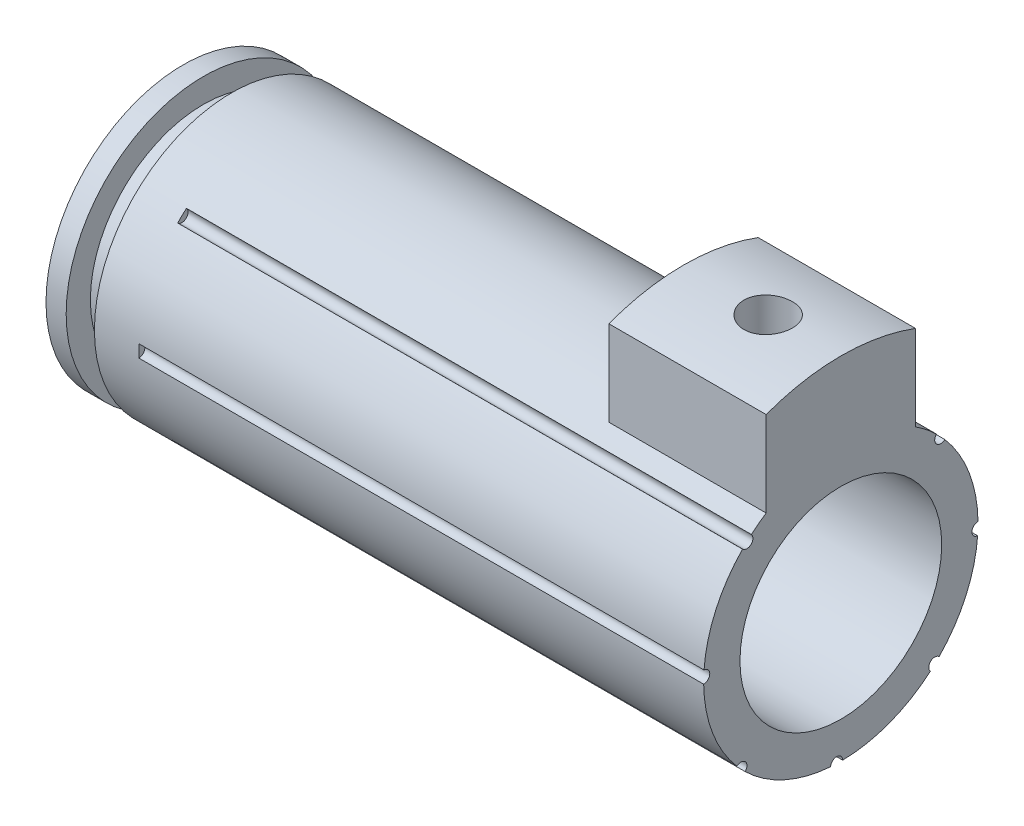
ISO-10303-21;
HEADER;
FILE_DESCRIPTION(('STEP AP214'),'2;1');
FILE_NAME('part.step','',(''),(''),'','','');
FILE_SCHEMA(('AUTOMOTIVE_DESIGN { 1 0 10303 214 1 1 1 1 }'));
ENDSEC;
DATA;
#1=APPLICATION_CONTEXT('core data for automotive mechanical design processes');
#2=APPLICATION_PROTOCOL_DEFINITION('international standard','automotive_design',2000,#1);
#3=PRODUCT_CONTEXT('',#1,'mechanical');
#4=PRODUCT('Part','Part','',(#3));
#5=PRODUCT_RELATED_PRODUCT_CATEGORY('part','',(#4));
#6=PRODUCT_DEFINITION_FORMATION('','',#4);
#7=PRODUCT_DEFINITION_CONTEXT('part definition',#1,'design');
#8=PRODUCT_DEFINITION('design','',#6,#7);
#9=PRODUCT_DEFINITION_SHAPE('','',#8);
#10=(LENGTH_UNIT() NAMED_UNIT(*) SI_UNIT(.MILLI.,.METRE.));
#11=(NAMED_UNIT(*) PLANE_ANGLE_UNIT() SI_UNIT($,.RADIAN.));
#12=(NAMED_UNIT(*) SI_UNIT($,.STERADIAN.) SOLID_ANGLE_UNIT());
#13=UNCERTAINTY_MEASURE_WITH_UNIT(LENGTH_MEASURE(1.E-05),#10,'distance_accuracy_value','');
#14=(GEOMETRIC_REPRESENTATION_CONTEXT(3) GLOBAL_UNCERTAINTY_ASSIGNED_CONTEXT((#13)) GLOBAL_UNIT_ASSIGNED_CONTEXT((#10,
#11,#12)) REPRESENTATION_CONTEXT('',''));
#15=CARTESIAN_POINT('',(0.,0.,0.));
#16=DIRECTION('',(0.,0.,1.));
#17=DIRECTION('',(1.,0.,0.));
#18=AXIS2_PLACEMENT_3D('',#15,#16,#17);
#19=CARTESIAN_POINT('',(20.701,0.,0.));
#20=DIRECTION('',(-1.,0.,0.));
#21=DIRECTION('',(0.,0.,1.));
#22=AXIS2_PLACEMENT_3D('',#19,#20,#21);
#23=PLANE('',#22);
#24=CARTESIAN_POINT('',(20.701,0.,0.));
#25=DIRECTION('',(1.,0.,0.));
#26=DIRECTION('',(0.,0.,-1.));
#27=AXIS2_PLACEMENT_3D('',#24,#25,#26);
#28=CIRCLE('',#27,6.35);
#29=CARTESIAN_POINT('',(20.701,0.,-6.35));
#30=VERTEX_POINT('',#29);
#31=EDGE_CURVE('E241',#30,#30,#28,.T.);
#32=ORIENTED_EDGE('',*,*,#31,.F.);
#33=EDGE_LOOP('',(#32));
#34=FACE_BOUND('',#33,.T.);
#35=CARTESIAN_POINT('',(20.701,0.,0.));
#36=DIRECTION('',(-1.,0.,0.));
#37=DIRECTION('',(0.,0.,1.));
#38=AXIS2_PLACEMENT_3D('',#35,#36,#37);
#39=CIRCLE('',#38,8.63599999999999);
#40=CARTESIAN_POINT('',(20.701,0.645457708168856,8.61184535085049));
#41=VERTEX_POINT('',#40);
#42=CARTESIAN_POINT('',(20.701,6.02400018450176,6.18804636190797));
#43=VERTEX_POINT('',#42);
#44=EDGE_CURVE('E169',#41,#43,#39,.T.);
#45=ORIENTED_EDGE('',*,*,#44,.F.);
#46=CARTESIAN_POINT('',(20.701,0.264987653431793,8.63193359239565));
#47=DIRECTION('',(1.,0.,0.));
#48=DIRECTION('',(0.,0.707106781186539,-0.707106781186556));
#49=AXIS2_PLACEMENT_3D('',#46,#47,#48);
#50=CIRCLE('',#49,0.381000000000001);
#51=CARTESIAN_POINT('',(20.701,-0.115998164471552,8.63522092513208));
#52=VERTEX_POINT('',#51);
#53=EDGE_CURVE('E157',#52,#41,#50,.T.);
#54=ORIENTED_EDGE('',*,*,#53,.F.);
#55=CARTESIAN_POINT('',(20.701,-5.63308672370091,6.54590176853154));
#56=VERTEX_POINT('',#55);
#57=EDGE_CURVE('E175',#56,#52,#39,.T.);
#58=ORIENTED_EDGE('',*,*,#57,.F.);
#59=CARTESIAN_POINT('',(20.701,-5.9163242112626,6.29107334460724));
#60=DIRECTION('',(1.,0.,0.));
#61=DIRECTION('',(0.,1.,0.));
#62=AXIS2_PLACEMENT_3D('',#59,#60,#61);
#63=CIRCLE('',#62,0.381000000000001);
#64=CARTESIAN_POINT('',(20.701,-6.1880463619079,6.02400018450183));
#65=VERTEX_POINT('',#64);
#66=EDGE_CURVE('E217',#65,#56,#63,.T.);
#67=ORIENTED_EDGE('',*,*,#66,.F.);
#68=CARTESIAN_POINT('',(20.701,-8.61184535085049,0.645457708168825));
#69=VERTEX_POINT('',#68);
#70=EDGE_CURVE('E179',#69,#65,#39,.T.);
#71=ORIENTED_EDGE('',*,*,#70,.F.);
#72=CARTESIAN_POINT('',(20.701,-8.63193359239565,0.264987653431762));
#73=DIRECTION('',(1.,0.,0.));
#74=DIRECTION('',(0.,0.707106781186554,0.707106781186541));
#75=AXIS2_PLACEMENT_3D('',#72,#73,#74);
#76=CIRCLE('',#75,0.381000000000001);
#77=CARTESIAN_POINT('',(20.701,-8.63522092513208,-0.115998164471582));
#78=VERTEX_POINT('',#77);
#79=EDGE_CURVE('E216',#78,#69,#76,.T.);
#80=ORIENTED_EDGE('',*,*,#79,.F.);
#81=CARTESIAN_POINT('',(20.701,-6.54590176853148,-5.63308672370098));
#82=VERTEX_POINT('',#81);
#83=EDGE_CURVE('E197',#82,#78,#39,.T.);
#84=ORIENTED_EDGE('',*,*,#83,.F.);
#85=CARTESIAN_POINT('',(20.701,-6.29107334460718,-5.91632421126266));
#86=DIRECTION('',(1.,0.,0.));
#87=DIRECTION('',(0.,0.,1.));
#88=AXIS2_PLACEMENT_3D('',#85,#86,#87);
#89=CIRCLE('',#88,0.381000000000001);
#90=CARTESIAN_POINT('',(20.701,-6.02400018450176,-6.18804636190797));
#91=VERTEX_POINT('',#90);
#92=EDGE_CURVE('E226',#91,#82,#89,.T.);
#93=ORIENTED_EDGE('',*,*,#92,.F.);
#94=CARTESIAN_POINT('',(20.701,-0.645457708168795,-8.61184535085049));
#95=VERTEX_POINT('',#94);
#96=EDGE_CURVE('E192',#95,#91,#39,.T.);
#97=ORIENTED_EDGE('',*,*,#96,.F.);
#98=CARTESIAN_POINT('',(20.701,-0.264987653431732,-8.63193359239565));
#99=DIRECTION('',(1.,0.,0.));
#100=DIRECTION('',(0.,-0.707106781186544,0.707106781186551));
#101=AXIS2_PLACEMENT_3D('',#98,#99,#100);
#102=CIRCLE('',#101,0.381000000000001);
#103=CARTESIAN_POINT('',(20.701,0.115998164471613,-8.63522092513208));
#104=VERTEX_POINT('',#103);
#105=EDGE_CURVE('E230',#104,#95,#102,.T.);
#106=ORIENTED_EDGE('',*,*,#105,.F.);
#107=CARTESIAN_POINT('',(20.701,5.63308672370095,-6.5459017685315));
#108=VERTEX_POINT('',#107);
#109=EDGE_CURVE('E181',#108,#104,#39,.T.);
#110=ORIENTED_EDGE('',*,*,#109,.F.);
#111=CARTESIAN_POINT('',(20.701,5.91632421126264,-6.2910733446072));
#112=DIRECTION('',(1.,0.,0.));
#113=DIRECTION('',(0.,-1.,0.));
#114=AXIS2_PLACEMENT_3D('',#111,#112,#113);
#115=CIRCLE('',#114,0.381000000000001);
#116=CARTESIAN_POINT('',(20.701,6.18804636190795,-6.02400018450179));
#117=VERTEX_POINT('',#116);
#118=EDGE_CURVE('E234',#117,#108,#115,.T.);
#119=ORIENTED_EDGE('',*,*,#118,.F.);
#120=CARTESIAN_POINT('',(20.701,7.24568112740271,-4.699));
#121=VERTEX_POINT('',#120);
#122=EDGE_CURVE('E178',#121,#117,#39,.T.);
#123=ORIENTED_EDGE('',*,*,#122,.F.);
#124=DIRECTION('',(0.,-1.,0.));
#125=VECTOR('',#124,1.);
#126=CARTESIAN_POINT('',(20.701,13.462,-4.699));
#127=LINE('',#126,#125);
#128=CARTESIAN_POINT('',(20.701,12.6152623040506,-4.699));
#129=VERTEX_POINT('',#128);
#130=EDGE_CURVE('E267',#129,#121,#127,.T.);
#131=ORIENTED_EDGE('',*,*,#130,.F.);
#132=CARTESIAN_POINT('',(20.701,0.,0.));
#133=DIRECTION('',(1.,0.,0.));
#134=DIRECTION('',(0.,0.,-1.));
#135=AXIS2_PLACEMENT_3D('',#132,#133,#134);
#136=CIRCLE('',#135,13.462);
#137=CARTESIAN_POINT('',(20.701,12.6152623040506,4.699));
#138=VERTEX_POINT('',#137);
#139=EDGE_CURVE('E251',#129,#138,#136,.T.);
#140=ORIENTED_EDGE('',*,*,#139,.T.);
#141=DIRECTION('',(0.,-1.,0.));
#142=VECTOR('',#141,1.);
#143=CARTESIAN_POINT('',(20.701,13.462,4.699));
#144=LINE('',#143,#142);
#145=CARTESIAN_POINT('',(20.701,7.2456811274027,4.699));
#146=VERTEX_POINT('',#145);
#147=EDGE_CURVE('E260',#138,#146,#144,.T.);
#148=ORIENTED_EDGE('',*,*,#147,.T.);
#149=CARTESIAN_POINT('',(20.701,6.54590176853148,5.63308672370098));
#150=VERTEX_POINT('',#149);
#151=EDGE_CURVE('E176',#150,#146,#39,.T.);
#152=ORIENTED_EDGE('',*,*,#151,.F.);
#153=CARTESIAN_POINT('',(20.701,6.29107334460718,5.91632421126266));
#154=DIRECTION('',(1.,0.,0.));
#155=DIRECTION('',(0.,0.,-1.));
#156=AXIS2_PLACEMENT_3D('',#153,#154,#155);
#157=CIRCLE('',#156,0.381000000000001);
#158=EDGE_CURVE('E174',#43,#150,#157,.T.);
#159=ORIENTED_EDGE('',*,*,#158,.F.);
#160=EDGE_LOOP('',(#45,#54,#58,#67,#71,#80,#84,#93,#97,#106,#110,#119,#123,#131,#140,#148,#152,#159));
#161=FACE_BOUND('',#160,.T.);
#162=ADVANCED_FACE('F34',(#34,#161),#23,.F.);
#163=CARTESIAN_POINT('',(10.795,13.462,-4.699));
#164=DIRECTION('',(0.,0.,1.));
#165=DIRECTION('',(1.,0.,0.));
#166=AXIS2_PLACEMENT_3D('',#163,#164,#165);
#167=PLANE('',#166);
#168=DIRECTION('',(1.,0.,0.));
#169=VECTOR('',#168,1.);
#170=CARTESIAN_POINT('',(7.239,12.6152623040506,-4.699));
#171=LINE('',#170,#169);
#172=CARTESIAN_POINT('',(10.795,12.6152623040506,-4.699));
#173=VERTEX_POINT('',#172);
#174=EDGE_CURVE('E256',#129,#173,#171,.F.);
#175=ORIENTED_EDGE('',*,*,#174,.F.);
#176=ORIENTED_EDGE('',*,*,#130,.T.);
#177=DIRECTION('',(-1.,0.,0.));
#178=VECTOR('',#177,1.);
#179=CARTESIAN_POINT('',(-78.2418042479738,7.2456811274027,-4.699));
#180=LINE('',#179,#178);
#181=CARTESIAN_POINT('',(10.795,7.2456811274027,-4.699));
#182=VERTEX_POINT('',#181);
#183=EDGE_CURVE('E340',#121,#182,#180,.T.);
#184=ORIENTED_EDGE('',*,*,#183,.T.);
#185=DIRECTION('',(0.,-1.,0.));
#186=VECTOR('',#185,1.);
#187=CARTESIAN_POINT('',(10.795,13.462,-4.699));
#188=LINE('',#187,#186);
#189=EDGE_CURVE('E265',#173,#182,#188,.T.);
#190=ORIENTED_EDGE('',*,*,#189,.F.);
#191=EDGE_LOOP('',(#175,#176,#184,#190));
#192=FACE_BOUND('',#191,.T.);
#193=ADVANCED_FACE('F298',(#192),#167,.F.);
#194=CARTESIAN_POINT('',(10.795,13.462,4.699));
#195=DIRECTION('',(1.,0.,0.));
#196=DIRECTION('',(0.,0.,-1.));
#197=AXIS2_PLACEMENT_3D('',#194,#195,#196);
#198=PLANE('',#197);
#199=CARTESIAN_POINT('',(10.795,0.,0.));
#200=DIRECTION('',(1.,0.,0.));
#201=DIRECTION('',(0.,0.,-1.));
#202=AXIS2_PLACEMENT_3D('',#199,#200,#201);
#203=CIRCLE('',#202,13.462);
#204=CARTESIAN_POINT('',(10.795,12.6152623040506,4.699));
#205=VERTEX_POINT('',#204);
#206=EDGE_CURVE('E254',#173,#205,#203,.T.);
#207=ORIENTED_EDGE('',*,*,#206,.F.);
#208=ORIENTED_EDGE('',*,*,#189,.T.);
#209=CARTESIAN_POINT('',(10.795,0.,0.));
#210=DIRECTION('',(1.,0.,0.));
#211=DIRECTION('',(0.,0.,-1.));
#212=AXIS2_PLACEMENT_3D('',#209,#210,#211);
#213=CIRCLE('',#212,8.63599999999998);
#214=CARTESIAN_POINT('',(10.795,7.2456811274027,4.69900000000001));
#215=VERTEX_POINT('',#214);
#216=EDGE_CURVE('E190',#182,#215,#213,.T.);
#217=ORIENTED_EDGE('',*,*,#216,.T.);
#218=DIRECTION('',(0.,-1.,0.));
#219=VECTOR('',#218,1.);
#220=CARTESIAN_POINT('',(10.795,13.462,4.699));
#221=LINE('',#220,#219);
#222=EDGE_CURVE('E263',#205,#215,#221,.T.);
#223=ORIENTED_EDGE('',*,*,#222,.F.);
#224=EDGE_LOOP('',(#207,#208,#217,#223));
#225=FACE_BOUND('',#224,.T.);
#226=ADVANCED_FACE('F294',(#225),#198,.F.);
#227=CARTESIAN_POINT('',(20.701,13.462,4.699));
#228=DIRECTION('',(0.,0.,-1.));
#229=DIRECTION('',(-1.,0.,0.));
#230=AXIS2_PLACEMENT_3D('',#227,#228,#229);
#231=PLANE('',#230);
#232=DIRECTION('',(1.,0.,0.));
#233=VECTOR('',#232,1.);
#234=CARTESIAN_POINT('',(7.239,12.6152623040506,4.699));
#235=LINE('',#234,#233);
#236=EDGE_CURVE('E253',#205,#138,#235,.T.);
#237=ORIENTED_EDGE('',*,*,#236,.F.);
#238=ORIENTED_EDGE('',*,*,#222,.T.);
#239=DIRECTION('',(-1.,0.,0.));
#240=VECTOR('',#239,1.);
#241=CARTESIAN_POINT('',(-78.2418042479738,7.2456811274027,4.69900000000001));
#242=LINE('',#241,#240);
#243=EDGE_CURVE('E185',#215,#146,#242,.F.);
#244=ORIENTED_EDGE('',*,*,#243,.T.);
#245=ORIENTED_EDGE('',*,*,#147,.F.);
#246=EDGE_LOOP('',(#237,#238,#244,#245));
#247=FACE_BOUND('',#246,.T.);
#248=ADVANCED_FACE('F286',(#247),#231,.F.);
#249=CARTESIAN_POINT('',(-78.2418042479738,0.,0.));
#250=DIRECTION('',(-1.,0.,0.));
#251=DIRECTION('',(0.,0.,1.));
#252=AXIS2_PLACEMENT_3D('',#249,#250,#251);
#253=CYLINDRICAL_SURFACE('',#252,8.63599999999998);
#254=CARTESIAN_POINT('',(-17.653,0.,0.));
#255=DIRECTION('',(-1.,0.,0.));
#256=DIRECTION('',(0.,0.,1.));
#257=AXIS2_PLACEMENT_3D('',#254,#255,#256);
#258=CIRCLE('',#257,8.63599999999998);
#259=CARTESIAN_POINT('',(-17.653,0.,8.63599999999998));
#260=VERTEX_POINT('',#259);
#261=EDGE_CURVE('E180',#260,#260,#258,.T.);
#262=ORIENTED_EDGE('',*,*,#261,.F.);
#263=EDGE_LOOP('',(#262));
#264=FACE_BOUND('',#263,.T.);
#265=CARTESIAN_POINT('',(-14.859,0.,0.));
#266=DIRECTION('',(1.,0.,0.));
#267=DIRECTION('',(0.,0.,-1.));
#268=AXIS2_PLACEMENT_3D('',#265,#266,#267);
#269=CIRCLE('',#268,8.63599999999998);
#270=CARTESIAN_POINT('',(-14.859,0.645457708168856,8.61184535085049));
#271=VERTEX_POINT('',#270);
#272=CARTESIAN_POINT('',(-14.859,-0.115998164471552,8.63522092513208));
#273=VERTEX_POINT('',#272);
#274=EDGE_CURVE('E171',#271,#273,#269,.T.);
#275=ORIENTED_EDGE('',*,*,#274,.F.);
#276=DIRECTION('',(1.,0.,0.));
#277=VECTOR('',#276,1.);
#278=CARTESIAN_POINT('',(2.921,0.645457708168856,8.61184535085049));
#279=LINE('',#278,#277);
#280=EDGE_CURVE('E12',#271,#41,#279,.T.);
#281=ORIENTED_EDGE('',*,*,#280,.T.);
#282=ORIENTED_EDGE('',*,*,#44,.T.);
#283=DIRECTION('',(1.,0.,0.));
#284=VECTOR('',#283,1.);
#285=CARTESIAN_POINT('',(2.921,6.02400018450176,6.18804636190797));
#286=LINE('',#285,#284);
#287=CARTESIAN_POINT('',(-14.859,6.02400018450176,6.18804636190797));
#288=VERTEX_POINT('',#287);
#289=EDGE_CURVE('E343',#43,#288,#286,.F.);
#290=ORIENTED_EDGE('',*,*,#289,.T.);
#291=CARTESIAN_POINT('',(-14.859,0.,0.));
#292=DIRECTION('',(1.,0.,0.));
#293=DIRECTION('',(0.,0.,-1.));
#294=AXIS2_PLACEMENT_3D('',#291,#292,#293);
#295=CIRCLE('',#294,8.63599999999998);
#296=CARTESIAN_POINT('',(-14.859,6.54590176853148,5.63308672370098));
#297=VERTEX_POINT('',#296);
#298=EDGE_CURVE('E339',#297,#288,#295,.T.);
#299=ORIENTED_EDGE('',*,*,#298,.F.);
#300=DIRECTION('',(1.,0.,0.));
#301=VECTOR('',#300,1.);
#302=CARTESIAN_POINT('',(2.921,6.54590176853148,5.63308672370098));
#303=LINE('',#302,#301);
#304=EDGE_CURVE('E345',#297,#150,#303,.T.);
#305=ORIENTED_EDGE('',*,*,#304,.T.);
#306=ORIENTED_EDGE('',*,*,#151,.T.);
#307=ORIENTED_EDGE('',*,*,#243,.F.);
#308=ORIENTED_EDGE('',*,*,#216,.F.);
#309=ORIENTED_EDGE('',*,*,#183,.F.);
#310=ORIENTED_EDGE('',*,*,#122,.T.);
#311=DIRECTION('',(1.,0.,0.));
#312=VECTOR('',#311,1.);
#313=CARTESIAN_POINT('',(2.921,6.18804636190795,-6.02400018450179));
#314=LINE('',#313,#312);
#315=CARTESIAN_POINT('',(-14.859,6.18804636190795,-6.02400018450179));
#316=VERTEX_POINT('',#315);
#317=EDGE_CURVE('E350',#117,#316,#314,.F.);
#318=ORIENTED_EDGE('',*,*,#317,.T.);
#319=CARTESIAN_POINT('',(-14.859,0.,0.));
#320=DIRECTION('',(1.,0.,0.));
#321=DIRECTION('',(0.,0.,-1.));
#322=AXIS2_PLACEMENT_3D('',#319,#320,#321);
#323=CIRCLE('',#322,8.63599999999998);
#324=CARTESIAN_POINT('',(-14.859,5.63308672370095,-6.5459017685315));
#325=VERTEX_POINT('',#324);
#326=EDGE_CURVE('E348',#325,#316,#323,.T.);
#327=ORIENTED_EDGE('',*,*,#326,.F.);
#328=DIRECTION('',(1.,0.,0.));
#329=VECTOR('',#328,1.);
#330=CARTESIAN_POINT('',(2.921,5.63308672370095,-6.5459017685315));
#331=LINE('',#330,#329);
#332=EDGE_CURVE('E352',#325,#108,#331,.T.);
#333=ORIENTED_EDGE('',*,*,#332,.T.);
#334=ORIENTED_EDGE('',*,*,#109,.T.);
#335=DIRECTION('',(1.,0.,0.));
#336=VECTOR('',#335,1.);
#337=CARTESIAN_POINT('',(2.921,0.115998164471613,-8.63522092513208));
#338=LINE('',#337,#336);
#339=CARTESIAN_POINT('',(-14.859,0.115998164471613,-8.63522092513208));
#340=VERTEX_POINT('',#339);
#341=EDGE_CURVE('E356',#104,#340,#338,.F.);
#342=ORIENTED_EDGE('',*,*,#341,.T.);
#343=CARTESIAN_POINT('',(-14.859,0.,0.));
#344=DIRECTION('',(1.,0.,0.));
#345=DIRECTION('',(0.,0.,-1.));
#346=AXIS2_PLACEMENT_3D('',#343,#344,#345);
#347=CIRCLE('',#346,8.63599999999998);
#348=CARTESIAN_POINT('',(-14.859,-0.645457708168795,-8.61184535085049));
#349=VERTEX_POINT('',#348);
#350=EDGE_CURVE('E354',#349,#340,#347,.T.);
#351=ORIENTED_EDGE('',*,*,#350,.F.);
#352=DIRECTION('',(1.,0.,0.));
#353=VECTOR('',#352,1.);
#354=CARTESIAN_POINT('',(2.921,-0.645457708168795,-8.61184535085049));
#355=LINE('',#354,#353);
#356=EDGE_CURVE('E358',#349,#95,#355,.T.);
#357=ORIENTED_EDGE('',*,*,#356,.T.);
#358=ORIENTED_EDGE('',*,*,#96,.T.);
#359=DIRECTION('',(1.,0.,0.));
#360=VECTOR('',#359,1.);
#361=CARTESIAN_POINT('',(2.921,-6.02400018450176,-6.18804636190797));
#362=LINE('',#361,#360);
#363=CARTESIAN_POINT('',(-14.859,-6.02400018450176,-6.18804636190797));
#364=VERTEX_POINT('',#363);
#365=EDGE_CURVE('E362',#91,#364,#362,.F.);
#366=ORIENTED_EDGE('',*,*,#365,.T.);
#367=CARTESIAN_POINT('',(-14.859,0.,0.));
#368=DIRECTION('',(1.,0.,0.));
#369=DIRECTION('',(0.,0.,-1.));
#370=AXIS2_PLACEMENT_3D('',#367,#368,#369);
#371=CIRCLE('',#370,8.63599999999998);
#372=CARTESIAN_POINT('',(-14.859,-6.54590176853148,-5.63308672370098));
#373=VERTEX_POINT('',#372);
#374=EDGE_CURVE('E360',#373,#364,#371,.T.);
#375=ORIENTED_EDGE('',*,*,#374,.F.);
#376=DIRECTION('',(1.,0.,0.));
#377=VECTOR('',#376,1.);
#378=CARTESIAN_POINT('',(2.921,-6.54590176853148,-5.63308672370098));
#379=LINE('',#378,#377);
#380=EDGE_CURVE('E364',#373,#82,#379,.T.);
#381=ORIENTED_EDGE('',*,*,#380,.T.);
#382=ORIENTED_EDGE('',*,*,#83,.T.);
#383=DIRECTION('',(1.,0.,0.));
#384=VECTOR('',#383,1.);
#385=CARTESIAN_POINT('',(2.921,-8.63522092513208,-0.115998164471582));
#386=LINE('',#385,#384);
#387=CARTESIAN_POINT('',(-14.859,-8.63522092513208,-0.115998164471582));
#388=VERTEX_POINT('',#387);
#389=EDGE_CURVE('E368',#78,#388,#386,.F.);
#390=ORIENTED_EDGE('',*,*,#389,.T.);
#391=CARTESIAN_POINT('',(-14.859,0.,0.));
#392=DIRECTION('',(1.,0.,0.));
#393=DIRECTION('',(0.,0.,-1.));
#394=AXIS2_PLACEMENT_3D('',#391,#392,#393);
#395=CIRCLE('',#394,8.63599999999998);
#396=CARTESIAN_POINT('',(-14.859,-8.61184535085049,0.645457708168825));
#397=VERTEX_POINT('',#396);
#398=EDGE_CURVE('E366',#397,#388,#395,.T.);
#399=ORIENTED_EDGE('',*,*,#398,.F.);
#400=DIRECTION('',(1.,0.,0.));
#401=VECTOR('',#400,1.);
#402=CARTESIAN_POINT('',(2.921,-8.61184535085049,0.645457708168825));
#403=LINE('',#402,#401);
#404=EDGE_CURVE('E213',#397,#69,#403,.T.);
#405=ORIENTED_EDGE('',*,*,#404,.T.);
#406=ORIENTED_EDGE('',*,*,#70,.T.);
#407=DIRECTION('',(1.,0.,0.));
#408=VECTOR('',#407,1.);
#409=CARTESIAN_POINT('',(2.921,-6.1880463619079,6.02400018450183));
#410=LINE('',#409,#408);
#411=CARTESIAN_POINT('',(-14.859,-6.1880463619079,6.02400018450183));
#412=VERTEX_POINT('',#411);
#413=EDGE_CURVE('E210',#65,#412,#410,.F.);
#414=ORIENTED_EDGE('',*,*,#413,.T.);
#415=CARTESIAN_POINT('',(-14.859,0.,0.));
#416=DIRECTION('',(1.,0.,0.));
#417=DIRECTION('',(0.,0.,-1.));
#418=AXIS2_PLACEMENT_3D('',#415,#416,#417);
#419=CIRCLE('',#418,8.63599999999998);
#420=CARTESIAN_POINT('',(-14.859,-5.63308672370091,6.54590176853154));
#421=VERTEX_POINT('',#420);
#422=EDGE_CURVE('E371',#421,#412,#419,.T.);
#423=ORIENTED_EDGE('',*,*,#422,.F.);
#424=DIRECTION('',(1.,0.,0.));
#425=VECTOR('',#424,1.);
#426=CARTESIAN_POINT('',(2.921,-5.63308672370091,6.54590176853154));
#427=LINE('',#426,#425);
#428=EDGE_CURVE('E374',#421,#56,#427,.T.);
#429=ORIENTED_EDGE('',*,*,#428,.T.);
#430=ORIENTED_EDGE('',*,*,#57,.T.);
#431=DIRECTION('',(1.,0.,0.));
#432=VECTOR('',#431,1.);
#433=CARTESIAN_POINT('',(2.921,-0.115998164471552,8.63522092513208));
#434=LINE('',#433,#432);
#435=EDGE_CURVE('E41',#52,#273,#434,.F.);
#436=ORIENTED_EDGE('',*,*,#435,.T.);
#437=EDGE_LOOP('',(#275,#281,#282,#290,#299,#305,#306,#307,#308,#309,#310,#318,#327,#333,#334,
#342,#351,#357,#358,#366,#375,#381,#382,#390,#399,#405,#406,#414,#423,#429,#430,#436));
#438=FACE_BOUND('',#437,.T.);
#439=ADVANCED_FACE('F167',(#264,#438),#253,.T.);
#440=CARTESIAN_POINT('',(-17.653,8.63599999999998,0.));
#441=DIRECTION('',(1.,0.,0.));
#442=DIRECTION('',(0.,0.,-1.));
#443=AXIS2_PLACEMENT_3D('',#440,#441,#442);
#444=PLANE('',#443);
#445=CARTESIAN_POINT('',(-17.653,0.,0.));
#446=DIRECTION('',(-1.,0.,0.));
#447=DIRECTION('',(0.,0.,1.));
#448=AXIS2_PLACEMENT_3D('',#445,#446,#447);
#449=CIRCLE('',#448,7.11199999999999);
#450=CARTESIAN_POINT('',(-17.653,0.,7.11199999999999));
#451=VERTEX_POINT('',#450);
#452=EDGE_CURVE('E278',#451,#451,#449,.T.);
#453=ORIENTED_EDGE('',*,*,#452,.F.);
#454=EDGE_LOOP('',(#453));
#455=FACE_BOUND('',#454,.T.);
#456=ORIENTED_EDGE('',*,*,#261,.T.);
#457=EDGE_LOOP('',(#456));
#458=FACE_BOUND('',#457,.T.);
#459=ADVANCED_FACE('F283',(#455,#458),#444,.F.);
#460=CARTESIAN_POINT('',(-78.2418042479738,0.,0.));
#461=DIRECTION('',(-1.,0.,0.));
#462=DIRECTION('',(0.,0.,1.));
#463=AXIS2_PLACEMENT_3D('',#460,#461,#462);
#464=CYLINDRICAL_SURFACE('',#463,7.11199999999998);
#465=CARTESIAN_POINT('',(-19.431,0.,0.));
#466=DIRECTION('',(-1.,0.,0.));
#467=DIRECTION('',(0.,0.,1.));
#468=AXIS2_PLACEMENT_3D('',#465,#466,#467);
#469=CIRCLE('',#468,7.11199999999998);
#470=CARTESIAN_POINT('',(-19.431,0.,7.11199999999998));
#471=VERTEX_POINT('',#470);
#472=EDGE_CURVE('E275',#471,#471,#469,.T.);
#473=ORIENTED_EDGE('',*,*,#472,.F.);
#474=EDGE_LOOP('',(#473));
#475=FACE_BOUND('',#474,.T.);
#476=ORIENTED_EDGE('',*,*,#452,.T.);
#477=EDGE_LOOP('',(#476));
#478=FACE_BOUND('',#477,.T.);
#479=ADVANCED_FACE('F291',(#475,#478),#464,.T.);
#480=CARTESIAN_POINT('',(-19.431,7.11199999999998,0.));
#481=DIRECTION('',(-1.,0.,0.));
#482=DIRECTION('',(0.,0.,1.));
#483=AXIS2_PLACEMENT_3D('',#480,#481,#482);
#484=PLANE('',#483);
#485=CARTESIAN_POINT('',(-19.431,0.,0.));
#486=DIRECTION('',(-1.,0.,0.));
#487=DIRECTION('',(0.,0.,1.));
#488=AXIS2_PLACEMENT_3D('',#485,#486,#487);
#489=CIRCLE('',#488,8.63599999999998);
#490=CARTESIAN_POINT('',(-19.431,0.,8.63599999999998));
#491=VERTEX_POINT('',#490);
#492=EDGE_CURVE('E272',#491,#491,#489,.T.);
#493=ORIENTED_EDGE('',*,*,#492,.F.);
#494=EDGE_LOOP('',(#493));
#495=FACE_BOUND('',#494,.T.);
#496=ORIENTED_EDGE('',*,*,#472,.T.);
#497=EDGE_LOOP('',(#496));
#498=FACE_BOUND('',#497,.T.);
#499=ADVANCED_FACE('F464',(#495,#498),#484,.F.);
#500=CARTESIAN_POINT('',(-78.2418042479738,0.,0.));
#501=DIRECTION('',(-1.,0.,0.));
#502=DIRECTION('',(0.,0.,1.));
#503=AXIS2_PLACEMENT_3D('',#500,#501,#502);
#504=CYLINDRICAL_SURFACE('',#503,8.63599999999998);
#505=CARTESIAN_POINT('',(-20.701,0.,0.));
#506=DIRECTION('',(-1.,0.,0.));
#507=DIRECTION('',(0.,0.,1.));
#508=AXIS2_PLACEMENT_3D('',#505,#506,#507);
#509=CIRCLE('',#508,8.63599999999999);
#510=CARTESIAN_POINT('',(-20.701,0.,8.63599999999999));
#511=VERTEX_POINT('',#510);
#512=EDGE_CURVE('E269',#511,#511,#509,.T.);
#513=ORIENTED_EDGE('',*,*,#512,.F.);
#514=EDGE_LOOP('',(#513));
#515=FACE_BOUND('',#514,.T.);
#516=ORIENTED_EDGE('',*,*,#492,.T.);
#517=EDGE_LOOP('',(#516));
#518=FACE_BOUND('',#517,.T.);
#519=ADVANCED_FACE('F455',(#515,#518),#504,.T.);
#520=CARTESIAN_POINT('',(-20.701,8.63599999999999,0.));
#521=DIRECTION('',(1.,0.,0.));
#522=DIRECTION('',(0.,0.,-1.));
#523=AXIS2_PLACEMENT_3D('',#520,#521,#522);
#524=PLANE('',#523);
#525=CARTESIAN_POINT('',(-20.701,0.,0.));
#526=DIRECTION('',(1.,0.,0.));
#527=DIRECTION('',(0.,0.,-1.));
#528=AXIS2_PLACEMENT_3D('',#525,#526,#527);
#529=CIRCLE('',#528,6.35);
#530=CARTESIAN_POINT('',(-20.701,0.,-6.35));
#531=VERTEX_POINT('',#530);
#532=EDGE_CURVE('E243',#531,#531,#529,.T.);
#533=ORIENTED_EDGE('',*,*,#532,.T.);
#534=EDGE_LOOP('',(#533));
#535=FACE_BOUND('',#534,.T.);
#536=ORIENTED_EDGE('',*,*,#512,.T.);
#537=EDGE_LOOP('',(#536));
#538=FACE_BOUND('',#537,.T.);
#539=ADVANCED_FACE('F450',(#535,#538),#524,.F.);
#540=CARTESIAN_POINT('',(7.239,0.,0.));
#541=DIRECTION('',(1.,0.,0.));
#542=DIRECTION('',(0.,0.,-1.));
#543=AXIS2_PLACEMENT_3D('',#540,#541,#542);
#544=CYLINDRICAL_SURFACE('',#543,13.462);
#545=CARTESIAN_POINT('',(16.129,13.3754576744125,1.524));
#546=CARTESIAN_POINT('',(16.2143089531988,13.3754587960841,1.52399633713164));
#547=CARTESIAN_POINT('',(16.2996727686285,13.3762826322088,1.51681284294915));
#548=CARTESIAN_POINT('',(16.4680291824272,13.3794881118573,1.48826751296834));
#549=CARTESIAN_POINT('',(16.5510191355446,13.3818714275764,1.46689045736625));
#550=CARTESIAN_POINT('',(16.7121656596995,13.3879225289008,1.41059238947023));
#551=CARTESIAN_POINT('',(16.7903252988888,13.3915894890777,1.37568007927202));
#552=CARTESIAN_POINT('',(16.9396601772047,13.399793701159,1.29332025003782));
#553=CARTESIAN_POINT('',(17.0108367031556,13.4043307922615,1.2458750464934));
#554=CARTESIAN_POINT('',(17.1445292785702,13.4137875147531,1.13956127643254));
#555=CARTESIAN_POINT('',(17.2070084709769,13.4187086439885,1.08064648953498));
#556=CARTESIAN_POINT('',(17.3212149242968,13.4283654287938,0.95316513782591));
#557=CARTESIAN_POINT('',(17.3729416720929,13.4331010755036,0.884598112662118));
#558=CARTESIAN_POINT('',(17.4643049917635,13.4418684183707,0.739529560236781));
#559=CARTESIAN_POINT('',(17.5039085321188,13.4458981786926,0.663007102973388));
#560=CARTESIAN_POINT('',(17.569689804469,13.4527833130625,0.504344603685502));
#561=CARTESIAN_POINT('',(17.5958679491557,13.4556387232091,0.422204734426195));
#562=CARTESIAN_POINT('',(17.6339460998938,13.4598428954699,0.255014133281343));
#563=CARTESIAN_POINT('',(17.645907075666,13.4611980894657,0.169977451739971));
#564=CARTESIAN_POINT('',(17.6554001642282,13.4622710584081,-0.000906331685698853));
#565=CARTESIAN_POINT('',(17.6529327481981,13.4619888868252,-0.086753407014011));
#566=CARTESIAN_POINT('',(17.6336882684558,13.4598241509078,-0.2564067403687));
#567=CARTESIAN_POINT('',(17.6169767699883,13.4579489195287,-0.340220542413637));
#568=CARTESIAN_POINT('',(17.5698208210961,13.4528170920612,-0.503846202856156));
#569=CARTESIAN_POINT('',(17.5393761500673,13.4495604737828,-0.583657996944227));
#570=CARTESIAN_POINT('',(17.4655472666997,13.4420192544486,-0.737218900946864));
#571=CARTESIAN_POINT('',(17.4221343618541,13.4377323780782,-0.810954099830359));
#572=CARTESIAN_POINT('',(17.323622194652,13.4286109661128,-0.950116970741353));
#573=CARTESIAN_POINT('',(17.2685224925849,13.4237764099148,-1.01554433004202));
#574=CARTESIAN_POINT('',(17.1478328227846,13.4140694360443,-1.1366188973477));
#575=CARTESIAN_POINT('',(17.0821857652322,13.4091969580786,-1.19220920775644));
#576=CARTESIAN_POINT('',(16.9424618829889,13.3999901970635,-1.29159031858122));
#577=CARTESIAN_POINT('',(16.8683850396986,13.3956559152015,-1.33538109296214));
#578=CARTESIAN_POINT('',(16.7138571425113,13.3880161512133,-1.4099215576248));
#579=CARTESIAN_POINT('',(16.6334041249118,13.3847109875865,-1.44066721166717));
#580=CARTESIAN_POINT('',(16.4684316172957,13.3795101064775,-1.48819694363694));
#581=CARTESIAN_POINT('',(16.3839122871644,13.3776143336267,-1.50498157003115));
#582=CARTESIAN_POINT('',(16.213707355721,13.3754567660083,-1.52403852268642));
#583=CARTESIAN_POINT('',(16.1280308026967,13.3751859824708,-1.52639068500703));
#584=CARTESIAN_POINT('',(15.9575040287331,13.3762853088206,-1.51672609974462));
#585=CARTESIAN_POINT('',(15.87265379344,13.3776553901532,-1.50470960220793));
#586=CARTESIAN_POINT('',(15.7064242203451,13.3818738851972,-1.46671581135876));
#587=CARTESIAN_POINT('',(15.6250360390123,13.3847182526718,-1.44077672226105));
#588=CARTESIAN_POINT('',(15.4677651095766,13.3915615556251,-1.3757132274284));
#589=CARTESIAN_POINT('',(15.391882521719,13.3955605246927,-1.33658843809885));
#590=CARTESIAN_POINT('',(15.247414256863,13.4042841008507,-1.24606601381195));
#591=CARTESIAN_POINT('',(15.1788617457005,13.4090117877876,-1.19461574973268));
#592=CARTESIAN_POINT('',(15.0513369516996,13.4186502446583,-1.08097777223077));
#593=CARTESIAN_POINT('',(14.9923649736389,13.4235610204105,-1.0187897173454));
#594=CARTESIAN_POINT('',(14.8853973549763,13.4330397182363,-0.885093887572723));
#595=CARTESIAN_POINT('',(14.8374539866931,13.437605941299,-0.813544153092107));
#596=CARTESIAN_POINT('',(14.7542652168428,13.4458559877061,-0.663361637545811));
#597=CARTESIAN_POINT('',(14.7190195994768,13.4495398260462,-0.584728976883174));
#598=CARTESIAN_POINT('',(14.6623142719299,13.455602434034,-0.422790761418786));
#599=CARTESIAN_POINT('',(14.6408236747876,13.4579841258903,-0.339496136082089));
#600=CARTESIAN_POINT('',(14.6121377778348,13.4611861561194,-0.17045222289065));
#601=CARTESIAN_POINT('',(14.6049419549117,13.4620065516272,-0.0847030249766807));
#602=CARTESIAN_POINT('',(14.6050584285613,13.4619934048517,0.0863040400723787));
#603=CARTESIAN_POINT('',(14.6122898549786,13.4611690818319,0.171561974421164));
#604=CARTESIAN_POINT('',(14.640885121375,13.4579773649454,0.339643050269887));
#605=CARTESIAN_POINT('',(14.6622489629197,13.4556099709077,0.422466191500107));
#606=CARTESIAN_POINT('',(14.7184786764052,13.4495971131306,0.583320944378217));
#607=CARTESIAN_POINT('',(14.7533414124398,13.4459519462471,0.661353664007011));
#608=CARTESIAN_POINT('',(14.8355708673575,13.437788516371,0.810473344125017));
#609=CARTESIAN_POINT('',(14.8829376253591,13.4332702506471,0.881560282883621));
#610=CARTESIAN_POINT('',(14.9891320564982,13.4238356151336,1.01518448868966));
#611=CARTESIAN_POINT('',(15.0480199843127,13.4189172354091,1.07767372988954));
#612=CARTESIAN_POINT('',(15.1754622203698,13.4092533072216,1.19191683682008));
#613=CARTESIAN_POINT('',(15.2440188285203,13.4045078002192,1.24366814103741));
#614=CARTESIAN_POINT('',(15.3890985071423,13.3957107743966,1.33510296517971));
#615=CARTESIAN_POINT('',(15.4656462897747,13.3916615173804,1.37474746754024));
#616=CARTESIAN_POINT('',(15.6243126265382,13.3847421243418,1.44056495798047));
#617=CARTESIAN_POINT('',(15.7064248945759,13.3818706828084,1.46675286976383));
#618=CARTESIAN_POINT('',(15.8456522489198,13.3783427633618,1.49851330273761));
#619=CARTESIAN_POINT('',(15.9018828724095,13.3772661062514,1.50805741437993));
#620=CARTESIAN_POINT('',(16.0150675087071,13.3758231892471,1.52080196787275));
#621=CARTESIAN_POINT('',(16.0720215173242,13.3754569252397,1.52400244645695));
#622=CARTESIAN_POINT('',(16.129,13.3754576744125,1.524));
#623=B_SPLINE_CURVE_WITH_KNOTS('',3,(#545,#546,#547,#548,#549,#550,#551,#552,#553,#554,#555,
#556,#557,#558,#559,#560,#561,#562,#563,#564,#565,#566,#567,#568,#569,#570,#571,#572,#573,#574,
#575,#576,#577,#578,#579,#580,#581,#582,#583,#584,#585,#586,#587,#588,#589,#590,#591,#592,#593,
#594,#595,#596,#597,#598,#599,#600,#601,#602,#603,#604,#605,#606,#607,#608,#609,#610,#611,#612,
#613,#614,#615,#616,#617,#618,#619,#620,#621,#622),.UNSPECIFIED.,.T.,.F.,(4,2,2,2,2,2,2,2,2,2,2,
2,2,2,2,2,2,2,2,2,2,2,2,2,2,2,2,2,2,2,2,2,2,2,2,2,2,2,4),(0.,0.255718747180567,
0.511712146241649,0.767541234046053,1.02332308963716,1.28015787340634,1.53700491076496,
1.79454566262074,2.05207849729257,2.30850288229059,2.56491889342641,2.82016096111878,
3.07540712906171,3.33122227124861,3.58704704007264,3.84430629996732,4.10156612748791,
4.35890549481736,4.61623475194792,4.8721392480575,5.12803929093029,5.38324069595282,
5.6384495258626,5.89476814165785,6.15109490991028,6.40861264630667,6.66612600597099,
6.9230590705053,7.17998273248534,7.43547028694226,7.69095786970123,7.9463861361291,
8.20181520166564,8.45861768153503,8.71548135086967,8.97316430562897,9.23056086323537,
9.40135830046625,9.57215474866745),.UNSPECIFIED.);
#624=CARTESIAN_POINT('',(16.129,13.3754576744125,1.524));
#625=VERTEX_POINT('',#624);
#626=EDGE_CURVE('E333',#625,#625,#623,.T.);
#627=ORIENTED_EDGE('',*,*,#626,.F.);
#628=EDGE_LOOP('',(#627));
#629=FACE_BOUND('',#628,.T.);
#630=ORIENTED_EDGE('',*,*,#174,.T.);
#631=ORIENTED_EDGE('',*,*,#206,.T.);
#632=ORIENTED_EDGE('',*,*,#236,.T.);
#633=ORIENTED_EDGE('',*,*,#139,.F.);
#634=EDGE_LOOP('',(#630,#631,#632,#633));
#635=FACE_BOUND('',#634,.T.);
#636=ADVANCED_FACE('F329',(#629,#635),#544,.T.);
#637=CARTESIAN_POINT('',(16.129,7.112,0.));
#638=DIRECTION('',(0.,1.,0.));
#639=DIRECTION('',(0.,0.,1.));
#640=AXIS2_PLACEMENT_3D('',#637,#638,#639);
#641=CYLINDRICAL_SURFACE('',#640,1.524);
#642=ORIENTED_EDGE('',*,*,#626,.T.);
#643=EDGE_LOOP('',(#642));
#644=FACE_BOUND('',#643,.T.);
#645=CARTESIAN_POINT('',(16.129,7.112,0.));
#646=DIRECTION('',(0.,1.,0.));
#647=DIRECTION('',(0.,0.,1.));
#648=AXIS2_PLACEMENT_3D('',#645,#646,#647);
#649=CIRCLE('',#648,1.524);
#650=CARTESIAN_POINT('',(16.129,7.112,1.524));
#651=VERTEX_POINT('',#650);
#652=EDGE_CURVE('E246',#651,#651,#649,.T.);
#653=ORIENTED_EDGE('',*,*,#652,.F.);
#654=EDGE_LOOP('',(#653));
#655=FACE_BOUND('',#654,.T.);
#656=ADVANCED_FACE('F320',(#644,#655),#641,.F.);
#657=CARTESIAN_POINT('',(16.129,7.112,0.));
#658=DIRECTION('',(0.,1.,0.));
#659=DIRECTION('',(0.,0.,1.));
#660=AXIS2_PLACEMENT_3D('',#657,#658,#659);
#661=PLANE('',#660);
#662=ORIENTED_EDGE('',*,*,#652,.T.);
#663=EDGE_LOOP('',(#662));
#664=FACE_BOUND('',#663,.T.);
#665=ADVANCED_FACE('F310',(#664),#661,.T.);
#666=CARTESIAN_POINT('',(-20.701,0.,0.));
#667=DIRECTION('',(1.,0.,0.));
#668=DIRECTION('',(0.,0.,-1.));
#669=AXIS2_PLACEMENT_3D('',#666,#667,#668);
#670=CYLINDRICAL_SURFACE('',#669,6.35);
#671=ORIENTED_EDGE('',*,*,#532,.F.);
#672=EDGE_LOOP('',(#671));
#673=FACE_BOUND('',#672,.T.);
#674=ORIENTED_EDGE('',*,*,#31,.T.);
#675=EDGE_LOOP('',(#674));
#676=FACE_BOUND('',#675,.T.);
#677=ADVANCED_FACE('F307',(#673,#676),#670,.F.);
#678=CARTESIAN_POINT('',(-14.859,6.29107334460718,5.91632421126266));
#679=DIRECTION('',(1.,0.,0.));
#680=DIRECTION('',(0.,0.,-1.));
#681=AXIS2_PLACEMENT_3D('',#678,#679,#680);
#682=CYLINDRICAL_SURFACE('',#681,0.381000000000001);
#683=CARTESIAN_POINT('',(-14.859,6.29107334460718,5.91632421126266));
#684=DIRECTION('',(1.,0.,0.));
#685=DIRECTION('',(0.,0.,-1.));
#686=AXIS2_PLACEMENT_3D('',#683,#684,#685);
#687=CIRCLE('',#686,0.381000000000001);
#688=EDGE_CURVE('E239',#288,#297,#687,.T.);
#689=ORIENTED_EDGE('',*,*,#688,.F.);
#690=ORIENTED_EDGE('',*,*,#289,.F.);
#691=ORIENTED_EDGE('',*,*,#158,.T.);
#692=ORIENTED_EDGE('',*,*,#304,.F.);
#693=EDGE_LOOP('',(#689,#690,#691,#692));
#694=FACE_BOUND('',#693,.T.);
#695=ADVANCED_FACE('F309',(#694),#682,.F.);
#696=CARTESIAN_POINT('',(-14.859,6.29107334460718,5.91632421126266));
#697=DIRECTION('',(1.,0.,0.));
#698=DIRECTION('',(0.,0.,-1.));
#699=AXIS2_PLACEMENT_3D('',#696,#697,#698);
#700=PLANE('',#699);
#701=ORIENTED_EDGE('',*,*,#298,.T.);
#702=ORIENTED_EDGE('',*,*,#688,.T.);
#703=EDGE_LOOP('',(#701,#702));
#704=FACE_BOUND('',#703,.T.);
#705=ADVANCED_FACE('F317',(#704),#700,.T.);
#706=CARTESIAN_POINT('',(-14.859,5.91632421126264,-6.2910733446072));
#707=DIRECTION('',(1.,0.,0.));
#708=DIRECTION('',(0.,0.,-1.));
#709=AXIS2_PLACEMENT_3D('',#706,#707,#708);
#710=CYLINDRICAL_SURFACE('',#709,0.381000000000001);
#711=CARTESIAN_POINT('',(-14.859,5.91632421126264,-6.2910733446072));
#712=DIRECTION('',(1.,0.,0.));
#713=DIRECTION('',(0.,-1.,0.));
#714=AXIS2_PLACEMENT_3D('',#711,#712,#713);
#715=CIRCLE('',#714,0.381000000000001);
#716=EDGE_CURVE('E236',#316,#325,#715,.T.);
#717=ORIENTED_EDGE('',*,*,#716,.F.);
#718=ORIENTED_EDGE('',*,*,#317,.F.);
#719=ORIENTED_EDGE('',*,*,#118,.T.);
#720=ORIENTED_EDGE('',*,*,#332,.F.);
#721=EDGE_LOOP('',(#717,#718,#719,#720));
#722=FACE_BOUND('',#721,.T.);
#723=ADVANCED_FACE('F413',(#722),#710,.F.);
#724=CARTESIAN_POINT('',(-14.859,5.91632421126264,-6.2910733446072));
#725=DIRECTION('',(1.,0.,0.));
#726=DIRECTION('',(0.,-1.,0.));
#727=AXIS2_PLACEMENT_3D('',#724,#725,#726);
#728=PLANE('',#727);
#729=ORIENTED_EDGE('',*,*,#326,.T.);
#730=ORIENTED_EDGE('',*,*,#716,.T.);
#731=EDGE_LOOP('',(#729,#730));
#732=FACE_BOUND('',#731,.T.);
#733=ADVANCED_FACE('F409',(#732),#728,.T.);
#734=CARTESIAN_POINT('',(-14.859,-0.264987653431732,-8.63193359239565));
#735=DIRECTION('',(1.,0.,0.));
#736=DIRECTION('',(0.,0.,-1.));
#737=AXIS2_PLACEMENT_3D('',#734,#735,#736);
#738=CYLINDRICAL_SURFACE('',#737,0.381000000000001);
#739=CARTESIAN_POINT('',(-14.859,-0.264987653431732,-8.63193359239565));
#740=DIRECTION('',(1.,0.,0.));
#741=DIRECTION('',(0.,-0.707106781186544,0.707106781186551));
#742=AXIS2_PLACEMENT_3D('',#739,#740,#741);
#743=CIRCLE('',#742,0.381000000000001);
#744=EDGE_CURVE('E232',#340,#349,#743,.T.);
#745=ORIENTED_EDGE('',*,*,#744,.F.);
#746=ORIENTED_EDGE('',*,*,#341,.F.);
#747=ORIENTED_EDGE('',*,*,#105,.T.);
#748=ORIENTED_EDGE('',*,*,#356,.F.);
#749=EDGE_LOOP('',(#745,#746,#747,#748));
#750=FACE_BOUND('',#749,.T.);
#751=ADVANCED_FACE('F405',(#750),#738,.F.);
#752=CARTESIAN_POINT('',(-14.859,-0.264987653431732,-8.63193359239565));
#753=DIRECTION('',(1.,0.,0.));
#754=DIRECTION('',(0.,-0.707106781186544,0.707106781186551));
#755=AXIS2_PLACEMENT_3D('',#752,#753,#754);
#756=PLANE('',#755);
#757=ORIENTED_EDGE('',*,*,#350,.T.);
#758=ORIENTED_EDGE('',*,*,#744,.T.);
#759=EDGE_LOOP('',(#757,#758));
#760=FACE_BOUND('',#759,.T.);
#761=ADVANCED_FACE('F401',(#760),#756,.T.);
#762=CARTESIAN_POINT('',(-14.859,-6.29107334460718,-5.91632421126266));
#763=DIRECTION('',(1.,0.,0.));
#764=DIRECTION('',(0.,0.,-1.));
#765=AXIS2_PLACEMENT_3D('',#762,#763,#764);
#766=CYLINDRICAL_SURFACE('',#765,0.381000000000001);
#767=CARTESIAN_POINT('',(-14.859,-6.29107334460718,-5.91632421126266));
#768=DIRECTION('',(1.,0.,0.));
#769=DIRECTION('',(0.,0.,1.));
#770=AXIS2_PLACEMENT_3D('',#767,#768,#769);
#771=CIRCLE('',#770,0.381000000000001);
#772=EDGE_CURVE('E228',#364,#373,#771,.T.);
#773=ORIENTED_EDGE('',*,*,#772,.F.);
#774=ORIENTED_EDGE('',*,*,#365,.F.);
#775=ORIENTED_EDGE('',*,*,#92,.T.);
#776=ORIENTED_EDGE('',*,*,#380,.F.);
#777=EDGE_LOOP('',(#773,#774,#775,#776));
#778=FACE_BOUND('',#777,.T.);
#779=ADVANCED_FACE('F397',(#778),#766,.F.);
#780=CARTESIAN_POINT('',(-14.859,-6.29107334460718,-5.91632421126266));
#781=DIRECTION('',(1.,0.,0.));
#782=DIRECTION('',(0.,0.,1.));
#783=AXIS2_PLACEMENT_3D('',#780,#781,#782);
#784=PLANE('',#783);
#785=ORIENTED_EDGE('',*,*,#374,.T.);
#786=ORIENTED_EDGE('',*,*,#772,.T.);
#787=EDGE_LOOP('',(#785,#786));
#788=FACE_BOUND('',#787,.T.);
#789=ADVANCED_FACE('F393',(#788),#784,.T.);
#790=CARTESIAN_POINT('',(-14.859,-8.63193359239565,0.264987653431762));
#791=DIRECTION('',(1.,0.,0.));
#792=DIRECTION('',(0.,0.,-1.));
#793=AXIS2_PLACEMENT_3D('',#790,#791,#792);
#794=CYLINDRICAL_SURFACE('',#793,0.381000000000001);
#795=CARTESIAN_POINT('',(-14.859,-8.63193359239565,0.264987653431762));
#796=DIRECTION('',(1.,0.,0.));
#797=DIRECTION('',(0.,0.707106781186554,0.707106781186541));
#798=AXIS2_PLACEMENT_3D('',#795,#796,#797);
#799=CIRCLE('',#798,0.381000000000001);
#800=EDGE_CURVE('E224',#388,#397,#799,.T.);
#801=ORIENTED_EDGE('',*,*,#800,.F.);
#802=ORIENTED_EDGE('',*,*,#389,.F.);
#803=ORIENTED_EDGE('',*,*,#79,.T.);
#804=ORIENTED_EDGE('',*,*,#404,.F.);
#805=EDGE_LOOP('',(#801,#802,#803,#804));
#806=FACE_BOUND('',#805,.T.);
#807=ADVANCED_FACE('F386',(#806),#794,.F.);
#808=CARTESIAN_POINT('',(-14.859,-8.63193359239565,0.264987653431762));
#809=DIRECTION('',(1.,0.,0.));
#810=DIRECTION('',(0.,0.707106781186554,0.707106781186541));
#811=AXIS2_PLACEMENT_3D('',#808,#809,#810);
#812=PLANE('',#811);
#813=ORIENTED_EDGE('',*,*,#398,.T.);
#814=ORIENTED_EDGE('',*,*,#800,.T.);
#815=EDGE_LOOP('',(#813,#814));
#816=FACE_BOUND('',#815,.T.);
#817=ADVANCED_FACE('F379',(#816),#812,.T.);
#818=CARTESIAN_POINT('',(-14.859,-5.9163242112626,6.29107334460724));
#819=DIRECTION('',(1.,0.,0.));
#820=DIRECTION('',(0.,0.,-1.));
#821=AXIS2_PLACEMENT_3D('',#818,#819,#820);
#822=CYLINDRICAL_SURFACE('',#821,0.381000000000001);
#823=CARTESIAN_POINT('',(-14.859,-5.9163242112626,6.29107334460724));
#824=DIRECTION('',(1.,0.,0.));
#825=DIRECTION('',(0.,1.,0.));
#826=AXIS2_PLACEMENT_3D('',#823,#824,#825);
#827=CIRCLE('',#826,0.381000000000001);
#828=EDGE_CURVE('E54',#412,#421,#827,.T.);
#829=ORIENTED_EDGE('',*,*,#828,.F.);
#830=ORIENTED_EDGE('',*,*,#413,.F.);
#831=ORIENTED_EDGE('',*,*,#66,.T.);
#832=ORIENTED_EDGE('',*,*,#428,.F.);
#833=EDGE_LOOP('',(#829,#830,#831,#832));
#834=FACE_BOUND('',#833,.T.);
#835=ADVANCED_FACE('F376',(#834),#822,.F.);
#836=CARTESIAN_POINT('',(-14.859,-5.9163242112626,6.29107334460724));
#837=DIRECTION('',(1.,0.,0.));
#838=DIRECTION('',(0.,1.,0.));
#839=AXIS2_PLACEMENT_3D('',#836,#837,#838);
#840=PLANE('',#839);
#841=ORIENTED_EDGE('',*,*,#422,.T.);
#842=ORIENTED_EDGE('',*,*,#828,.T.);
#843=EDGE_LOOP('',(#841,#842));
#844=FACE_BOUND('',#843,.T.);
#845=ADVANCED_FACE('F378',(#844),#840,.T.);
#846=CARTESIAN_POINT('',(-14.859,0.264987653431793,8.63193359239565));
#847=DIRECTION('',(1.,0.,0.));
#848=DIRECTION('',(0.,0.,-1.));
#849=AXIS2_PLACEMENT_3D('',#846,#847,#848);
#850=CYLINDRICAL_SURFACE('',#849,0.381000000000001);
#851=CARTESIAN_POINT('',(-14.859,0.264987653431793,8.63193359239565));
#852=DIRECTION('',(1.,0.,0.));
#853=DIRECTION('',(0.,0.707106781186539,-0.707106781186556));
#854=AXIS2_PLACEMENT_3D('',#851,#852,#853);
#855=CIRCLE('',#854,0.381000000000001);
#856=EDGE_CURVE('E47',#273,#271,#855,.T.);
#857=ORIENTED_EDGE('',*,*,#856,.F.);
#858=ORIENTED_EDGE('',*,*,#435,.F.);
#859=ORIENTED_EDGE('',*,*,#53,.T.);
#860=ORIENTED_EDGE('',*,*,#280,.F.);
#861=EDGE_LOOP('',(#857,#858,#859,#860));
#862=FACE_BOUND('',#861,.T.);
#863=ADVANCED_FACE('F158',(#862),#850,.F.);
#864=CARTESIAN_POINT('',(-14.859,0.264987653431793,8.63193359239565));
#865=DIRECTION('',(1.,0.,0.));
#866=DIRECTION('',(0.,0.707106781186539,-0.707106781186556));
#867=AXIS2_PLACEMENT_3D('',#864,#865,#866);
#868=PLANE('',#867);
#869=ORIENTED_EDGE('',*,*,#274,.T.);
#870=ORIENTED_EDGE('',*,*,#856,.T.);
#871=EDGE_LOOP('',(#869,#870));
#872=FACE_BOUND('',#871,.T.);
#873=ADVANCED_FACE('F621',(#872),#868,.T.);
#874=CLOSED_SHELL('',(#162,#193,#226,#248,#439,#459,#479,#499,#519,#539,#636,#656,#665,#677,
#695,#705,#723,#733,#751,#761,#779,#789,#807,#817,#835,#845,#863,#873));
#875=MANIFOLD_SOLID_BREP('B2',#874);
#876=ADVANCED_BREP_SHAPE_REPRESENTATION('',(#18,#875),#14);
#877=SHAPE_DEFINITION_REPRESENTATION(#9,#876);
ENDSEC;
END-ISO-10303-21;
